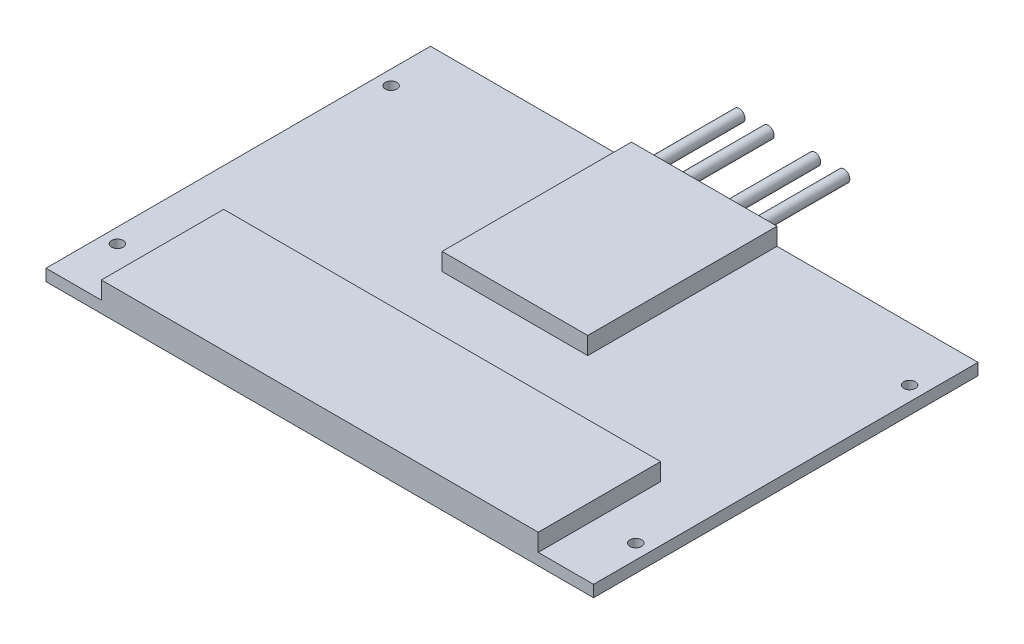
ISO-10303-21;
HEADER;
FILE_DESCRIPTION(('STEP AP214'),'2;1');
FILE_NAME('part.step','',(''),(''),'','','');
FILE_SCHEMA(('AUTOMOTIVE_DESIGN { 1 0 10303 214 1 1 1 1 }'));
ENDSEC;
DATA;
#1=APPLICATION_CONTEXT('core data for automotive mechanical design processes');
#2=APPLICATION_PROTOCOL_DEFINITION('international standard','automotive_design',2000,#1);
#3=PRODUCT_CONTEXT('',#1,'mechanical');
#4=PRODUCT('Part','Part','',(#3));
#5=PRODUCT_RELATED_PRODUCT_CATEGORY('part','',(#4));
#6=PRODUCT_DEFINITION_FORMATION('','',#4);
#7=PRODUCT_DEFINITION_CONTEXT('part definition',#1,'design');
#8=PRODUCT_DEFINITION('design','',#6,#7);
#9=PRODUCT_DEFINITION_SHAPE('','',#8);
#10=(LENGTH_UNIT() NAMED_UNIT(*) SI_UNIT(.MILLI.,.METRE.));
#11=(NAMED_UNIT(*) PLANE_ANGLE_UNIT() SI_UNIT($,.RADIAN.));
#12=(NAMED_UNIT(*) SI_UNIT($,.STERADIAN.) SOLID_ANGLE_UNIT());
#13=UNCERTAINTY_MEASURE_WITH_UNIT(LENGTH_MEASURE(1.E-05),#10,'distance_accuracy_value','');
#14=(GEOMETRIC_REPRESENTATION_CONTEXT(3) GLOBAL_UNCERTAINTY_ASSIGNED_CONTEXT((#13)) GLOBAL_UNIT_ASSIGNED_CONTEXT((#10,
#11,#12)) REPRESENTATION_CONTEXT('',''));
#15=CARTESIAN_POINT('',(0.,0.,0.));
#16=DIRECTION('',(0.,0.,1.));
#17=DIRECTION('',(1.,0.,0.));
#18=AXIS2_PLACEMENT_3D('',#15,#16,#17);
#19=CARTESIAN_POINT('',(0.,4.,0.));
#20=DIRECTION('',(0.,1.,0.));
#21=DIRECTION('',(0.,0.,1.));
#22=AXIS2_PLACEMENT_3D('',#19,#20,#21);
#23=PLANE('',#22);
#24=CARTESIAN_POINT('',(-89.0000000000001,4.,-113.5));
#25=DIRECTION('',(0.,1.,0.));
#26=DIRECTION('',(0.,0.,-1.));
#27=AXIS2_PLACEMENT_3D('',#24,#25,#26);
#28=CIRCLE('',#27,2.);
#29=CARTESIAN_POINT('',(-89.0000000000001,4.,-115.5));
#30=VERTEX_POINT('',#29);
#31=EDGE_CURVE('E506',#30,#30,#28,.T.);
#32=ORIENTED_EDGE('',*,*,#31,.F.);
#33=EDGE_LOOP('',(#32));
#34=FACE_BOUND('',#33,.T.);
#35=CARTESIAN_POINT('',(-89.0000000000001,4.,-19.5));
#36=DIRECTION('',(0.,1.,0.));
#37=DIRECTION('',(0.,0.,-1.));
#38=AXIS2_PLACEMENT_3D('',#35,#36,#37);
#39=CIRCLE('',#38,2.);
#40=CARTESIAN_POINT('',(-89.0000000000001,4.,-21.5));
#41=VERTEX_POINT('',#40);
#42=EDGE_CURVE('E507',#41,#41,#39,.T.);
#43=ORIENTED_EDGE('',*,*,#42,.F.);
#44=EDGE_LOOP('',(#43));
#45=FACE_BOUND('',#44,.T.);
#46=CARTESIAN_POINT('',(89.0000000000001,4.,-19.5));
#47=DIRECTION('',(0.,1.,0.));
#48=DIRECTION('',(0.,0.,1.));
#49=AXIS2_PLACEMENT_3D('',#46,#47,#48);
#50=CIRCLE('',#49,2.);
#51=CARTESIAN_POINT('',(89.0000000000001,4.,-17.5));
#52=VERTEX_POINT('',#51);
#53=EDGE_CURVE('E509',#52,#52,#50,.T.);
#54=ORIENTED_EDGE('',*,*,#53,.F.);
#55=EDGE_LOOP('',(#54));
#56=FACE_BOUND('',#55,.T.);
#57=CARTESIAN_POINT('',(89.0000000000001,4.,-113.5));
#58=DIRECTION('',(0.,1.,0.));
#59=DIRECTION('',(0.,0.,1.));
#60=AXIS2_PLACEMENT_3D('',#57,#58,#59);
#61=CIRCLE('',#60,2.);
#62=CARTESIAN_POINT('',(89.0000000000001,4.,-111.5));
#63=VERTEX_POINT('',#62);
#64=EDGE_CURVE('E231',#63,#63,#61,.T.);
#65=ORIENTED_EDGE('',*,*,#64,.F.);
#66=EDGE_LOOP('',(#65));
#67=FACE_BOUND('',#66,.T.);
#68=DIRECTION('',(1.,0.,0.));
#69=VECTOR('',#68,1.);
#70=CARTESIAN_POINT('',(-93.9999999999999,4.,0.));
#71=LINE('',#70,#69);
#72=CARTESIAN_POINT('',(-93.9999999999999,4.,0.));
#73=VERTEX_POINT('',#72);
#74=CARTESIAN_POINT('',(-75.,4.,0.));
#75=VERTEX_POINT('',#74);
#76=EDGE_CURVE('E152',#73,#75,#71,.T.);
#77=ORIENTED_EDGE('',*,*,#76,.T.);
#78=DIRECTION('',(0.,0.,1.));
#79=VECTOR('',#78,1.);
#80=CARTESIAN_POINT('',(-75.,4.,0.));
#81=LINE('',#80,#79);
#82=CARTESIAN_POINT('',(-75.,4.,-42.));
#83=VERTEX_POINT('',#82);
#84=EDGE_CURVE('E146',#83,#75,#81,.T.);
#85=ORIENTED_EDGE('',*,*,#84,.F.);
#86=DIRECTION('',(-1.,0.,0.));
#87=VECTOR('',#86,1.);
#88=CARTESIAN_POINT('',(-75.,4.,-42.));
#89=LINE('',#88,#87);
#90=CARTESIAN_POINT('',(75.,4.,-42.));
#91=VERTEX_POINT('',#90);
#92=EDGE_CURVE('E132',#91,#83,#89,.T.);
#93=ORIENTED_EDGE('',*,*,#92,.F.);
#94=DIRECTION('',(0.,0.,-1.));
#95=VECTOR('',#94,1.);
#96=CARTESIAN_POINT('',(75.,4.,0.));
#97=LINE('',#96,#95);
#98=CARTESIAN_POINT('',(75.,4.,0.));
#99=VERTEX_POINT('',#98);
#100=EDGE_CURVE('E139',#99,#91,#97,.T.);
#101=ORIENTED_EDGE('',*,*,#100,.F.);
#102=CARTESIAN_POINT('',(94.0000000000001,4.,0.));
#103=VERTEX_POINT('',#102);
#104=EDGE_CURVE('E192',#99,#103,#71,.T.);
#105=ORIENTED_EDGE('',*,*,#104,.T.);
#106=DIRECTION('',(0.,0.,-1.));
#107=VECTOR('',#106,1.);
#108=CARTESIAN_POINT('',(94.,4.,-132.));
#109=LINE('',#108,#107);
#110=CARTESIAN_POINT('',(94.,4.,-132.));
#111=VERTEX_POINT('',#110);
#112=EDGE_CURVE('E195',#103,#111,#109,.T.);
#113=ORIENTED_EDGE('',*,*,#112,.T.);
#114=DIRECTION('',(-1.,0.,0.));
#115=VECTOR('',#114,1.);
#116=CARTESIAN_POINT('',(-94.,4.,-132.));
#117=LINE('',#116,#115);
#118=CARTESIAN_POINT('',(25.,4.,-132.));
#119=VERTEX_POINT('',#118);
#120=EDGE_CURVE('E198',#111,#119,#117,.T.);
#121=ORIENTED_EDGE('',*,*,#120,.T.);
#122=DIRECTION('',(0.,0.,-1.));
#123=VECTOR('',#122,1.);
#124=CARTESIAN_POINT('',(25.,4.,-132.));
#125=LINE('',#124,#123);
#126=CARTESIAN_POINT('',(25.,4.,-67.));
#127=VERTEX_POINT('',#126);
#128=EDGE_CURVE('E169',#127,#119,#125,.T.);
#129=ORIENTED_EDGE('',*,*,#128,.F.);
#130=DIRECTION('',(1.,0.,0.));
#131=VECTOR('',#130,1.);
#132=CARTESIAN_POINT('',(-25.,4.,-67.));
#133=LINE('',#132,#131);
#134=CARTESIAN_POINT('',(-25.,4.,-67.));
#135=VERTEX_POINT('',#134);
#136=EDGE_CURVE('E66',#135,#127,#133,.T.);
#137=ORIENTED_EDGE('',*,*,#136,.F.);
#138=DIRECTION('',(0.,0.,1.));
#139=VECTOR('',#138,1.);
#140=CARTESIAN_POINT('',(-25.,4.,-132.));
#141=LINE('',#140,#139);
#142=CARTESIAN_POINT('',(-25.,4.,-132.));
#143=VERTEX_POINT('',#142);
#144=EDGE_CURVE('E153',#143,#135,#141,.T.);
#145=ORIENTED_EDGE('',*,*,#144,.F.);
#146=CARTESIAN_POINT('',(-94.,4.,-132.));
#147=VERTEX_POINT('',#146);
#148=EDGE_CURVE('E197',#143,#147,#117,.T.);
#149=ORIENTED_EDGE('',*,*,#148,.T.);
#150=DIRECTION('',(0.,0.,1.));
#151=VECTOR('',#150,1.);
#152=CARTESIAN_POINT('',(-94.,4.,-132.));
#153=LINE('',#152,#151);
#154=EDGE_CURVE('E190',#147,#73,#153,.T.);
#155=ORIENTED_EDGE('',*,*,#154,.T.);
#156=EDGE_LOOP('',(#77,#85,#93,#101,#105,#113,#121,#129,#137,#145,#149,#155));
#157=FACE_BOUND('',#156,.T.);
#158=ADVANCED_FACE('F41',(#34,#45,#56,#67,#157),#23,.T.);
#159=CARTESIAN_POINT('',(-94.,4.,-132.));
#160=DIRECTION('',(1.,0.,0.));
#161=DIRECTION('',(0.,0.,-1.));
#162=AXIS2_PLACEMENT_3D('',#159,#160,#161);
#163=PLANE('',#162);
#164=DIRECTION('',(0.,0.,1.));
#165=VECTOR('',#164,1.);
#166=CARTESIAN_POINT('',(-94.,0.,-132.));
#167=LINE('',#166,#165);
#168=CARTESIAN_POINT('',(-94.,0.,-132.));
#169=VERTEX_POINT('',#168);
#170=CARTESIAN_POINT('',(-93.9999999999999,0.,0.));
#171=VERTEX_POINT('',#170);
#172=EDGE_CURVE('E189',#169,#171,#167,.T.);
#173=ORIENTED_EDGE('',*,*,#172,.T.);
#174=DIRECTION('',(0.,-1.,0.));
#175=VECTOR('',#174,1.);
#176=CARTESIAN_POINT('',(-93.9999999999999,4.,0.));
#177=LINE('',#176,#175);
#178=EDGE_CURVE('E216',#73,#171,#177,.T.);
#179=ORIENTED_EDGE('',*,*,#178,.F.);
#180=ORIENTED_EDGE('',*,*,#154,.F.);
#181=DIRECTION('',(0.,-1.,0.));
#182=VECTOR('',#181,1.);
#183=CARTESIAN_POINT('',(-94.,4.,-132.));
#184=LINE('',#183,#182);
#185=EDGE_CURVE('E200',#147,#169,#184,.T.);
#186=ORIENTED_EDGE('',*,*,#185,.T.);
#187=EDGE_LOOP('',(#173,#179,#180,#186));
#188=FACE_BOUND('',#187,.T.);
#189=ADVANCED_FACE('F43',(#188),#163,.F.);
#190=CARTESIAN_POINT('',(-93.9999999999999,4.,0.));
#191=DIRECTION('',(0.,0.,-1.));
#192=DIRECTION('',(-1.,0.,0.));
#193=AXIS2_PLACEMENT_3D('',#190,#191,#192);
#194=PLANE('',#193);
#195=DIRECTION('',(1.,0.,0.));
#196=VECTOR('',#195,1.);
#197=CARTESIAN_POINT('',(-93.9999999999999,0.,0.));
#198=LINE('',#197,#196);
#199=CARTESIAN_POINT('',(94.0000000000001,0.,0.));
#200=VERTEX_POINT('',#199);
#201=EDGE_CURVE('E203',#171,#200,#198,.T.);
#202=ORIENTED_EDGE('',*,*,#201,.T.);
#203=DIRECTION('',(0.,-1.,0.));
#204=VECTOR('',#203,1.);
#205=CARTESIAN_POINT('',(94.0000000000001,4.,0.));
#206=LINE('',#205,#204);
#207=EDGE_CURVE('E213',#103,#200,#206,.T.);
#208=ORIENTED_EDGE('',*,*,#207,.F.);
#209=ORIENTED_EDGE('',*,*,#104,.F.);
#210=DIRECTION('',(0.,-1.,0.));
#211=VECTOR('',#210,1.);
#212=CARTESIAN_POINT('',(75.,10.,0.));
#213=LINE('',#212,#211);
#214=CARTESIAN_POINT('',(75.,10.,0.));
#215=VERTEX_POINT('',#214);
#216=EDGE_CURVE('E259',#215,#99,#213,.T.);
#217=ORIENTED_EDGE('',*,*,#216,.F.);
#218=DIRECTION('',(1.,0.,0.));
#219=VECTOR('',#218,1.);
#220=CARTESIAN_POINT('',(-75.,10.,0.));
#221=LINE('',#220,#219);
#222=CARTESIAN_POINT('',(-75.,10.,0.));
#223=VERTEX_POINT('',#222);
#224=EDGE_CURVE('E162',#223,#215,#221,.T.);
#225=ORIENTED_EDGE('',*,*,#224,.F.);
#226=DIRECTION('',(0.,-1.,0.));
#227=VECTOR('',#226,1.);
#228=CARTESIAN_POINT('',(-75.,10.,0.));
#229=LINE('',#228,#227);
#230=EDGE_CURVE('E257',#223,#75,#229,.T.);
#231=ORIENTED_EDGE('',*,*,#230,.T.);
#232=ORIENTED_EDGE('',*,*,#76,.F.);
#233=ORIENTED_EDGE('',*,*,#178,.T.);
#234=EDGE_LOOP('',(#202,#208,#209,#217,#225,#231,#232,#233));
#235=FACE_BOUND('',#234,.T.);
#236=ADVANCED_FACE('F268',(#235),#194,.F.);
#237=CARTESIAN_POINT('',(94.,4.,-132.));
#238=DIRECTION('',(-1.,0.,0.));
#239=DIRECTION('',(0.,0.,1.));
#240=AXIS2_PLACEMENT_3D('',#237,#238,#239);
#241=PLANE('',#240);
#242=DIRECTION('',(0.,0.,-1.));
#243=VECTOR('',#242,1.);
#244=CARTESIAN_POINT('',(94.,0.,-132.));
#245=LINE('',#244,#243);
#246=CARTESIAN_POINT('',(94.,0.,-132.));
#247=VERTEX_POINT('',#246);
#248=EDGE_CURVE('E205',#200,#247,#245,.T.);
#249=ORIENTED_EDGE('',*,*,#248,.T.);
#250=DIRECTION('',(0.,-1.,0.));
#251=VECTOR('',#250,1.);
#252=CARTESIAN_POINT('',(94.,4.,-132.));
#253=LINE('',#252,#251);
#254=EDGE_CURVE('E210',#111,#247,#253,.T.);
#255=ORIENTED_EDGE('',*,*,#254,.F.);
#256=ORIENTED_EDGE('',*,*,#112,.F.);
#257=ORIENTED_EDGE('',*,*,#207,.T.);
#258=EDGE_LOOP('',(#249,#255,#256,#257));
#259=FACE_BOUND('',#258,.T.);
#260=ADVANCED_FACE('F273',(#259),#241,.F.);
#261=CARTESIAN_POINT('',(-94.,4.,-132.));
#262=DIRECTION('',(0.,0.,1.));
#263=DIRECTION('',(1.,0.,0.));
#264=AXIS2_PLACEMENT_3D('',#261,#262,#263);
#265=PLANE('',#264);
#266=CARTESIAN_POINT('',(-18.,6.50000000000001,-132.));
#267=DIRECTION('',(0.,0.,1.));
#268=DIRECTION('',(1.,0.,0.));
#269=AXIS2_PLACEMENT_3D('',#266,#267,#268);
#270=CIRCLE('',#269,2.);
#271=CARTESIAN_POINT('',(-16.,6.50000000000001,-132.));
#272=VERTEX_POINT('',#271);
#273=EDGE_CURVE('E11',#272,#272,#270,.F.);
#274=ORIENTED_EDGE('',*,*,#273,.F.);
#275=EDGE_LOOP('',(#274));
#276=FACE_BOUND('',#275,.T.);
#277=CARTESIAN_POINT('',(-8.00000000000003,6.50000000000001,-132.));
#278=DIRECTION('',(0.,0.,1.));
#279=DIRECTION('',(1.,0.,0.));
#280=AXIS2_PLACEMENT_3D('',#277,#278,#279);
#281=CIRCLE('',#280,2.);
#282=CARTESIAN_POINT('',(-6.00000000000003,6.50000000000001,-132.));
#283=VERTEX_POINT('',#282);
#284=EDGE_CURVE('E50',#283,#283,#281,.F.);
#285=ORIENTED_EDGE('',*,*,#284,.F.);
#286=EDGE_LOOP('',(#285));
#287=FACE_BOUND('',#286,.T.);
#288=CARTESIAN_POINT('',(7.99999999999999,6.50000000000001,-132.));
#289=DIRECTION('',(0.,0.,1.));
#290=DIRECTION('',(1.,0.,0.));
#291=AXIS2_PLACEMENT_3D('',#288,#289,#290);
#292=CIRCLE('',#291,2.);
#293=CARTESIAN_POINT('',(9.99999999999999,6.50000000000001,-132.));
#294=VERTEX_POINT('',#293);
#295=EDGE_CURVE('E222',#294,#294,#292,.F.);
#296=ORIENTED_EDGE('',*,*,#295,.F.);
#297=EDGE_LOOP('',(#296));
#298=FACE_BOUND('',#297,.T.);
#299=CARTESIAN_POINT('',(18.,6.50000000000001,-132.));
#300=DIRECTION('',(0.,0.,1.));
#301=DIRECTION('',(1.,0.,0.));
#302=AXIS2_PLACEMENT_3D('',#299,#300,#301);
#303=CIRCLE('',#302,2.);
#304=CARTESIAN_POINT('',(20.,6.50000000000001,-132.));
#305=VERTEX_POINT('',#304);
#306=EDGE_CURVE('E219',#305,#305,#303,.F.);
#307=ORIENTED_EDGE('',*,*,#306,.F.);
#308=EDGE_LOOP('',(#307));
#309=FACE_BOUND('',#308,.T.);
#310=DIRECTION('',(-1.,0.,0.));
#311=VECTOR('',#310,1.);
#312=CARTESIAN_POINT('',(-94.,0.,-132.));
#313=LINE('',#312,#311);
#314=EDGE_CURVE('E193',#247,#169,#313,.T.);
#315=ORIENTED_EDGE('',*,*,#314,.T.);
#316=ORIENTED_EDGE('',*,*,#185,.F.);
#317=ORIENTED_EDGE('',*,*,#148,.F.);
#318=DIRECTION('',(0.,-1.,0.));
#319=VECTOR('',#318,1.);
#320=CARTESIAN_POINT('',(-25.,10.,-132.));
#321=LINE('',#320,#319);
#322=CARTESIAN_POINT('',(-25.,10.,-132.));
#323=VERTEX_POINT('',#322);
#324=EDGE_CURVE('E174',#323,#143,#321,.T.);
#325=ORIENTED_EDGE('',*,*,#324,.F.);
#326=DIRECTION('',(-1.,0.,0.));
#327=VECTOR('',#326,1.);
#328=CARTESIAN_POINT('',(-25.,10.,-132.));
#329=LINE('',#328,#327);
#330=CARTESIAN_POINT('',(25.,10.,-132.));
#331=VERTEX_POINT('',#330);
#332=EDGE_CURVE('E173',#331,#323,#329,.T.);
#333=ORIENTED_EDGE('',*,*,#332,.F.);
#334=DIRECTION('',(0.,-1.,0.));
#335=VECTOR('',#334,1.);
#336=CARTESIAN_POINT('',(25.,10.,-132.));
#337=LINE('',#336,#335);
#338=EDGE_CURVE('E181',#331,#119,#337,.T.);
#339=ORIENTED_EDGE('',*,*,#338,.T.);
#340=ORIENTED_EDGE('',*,*,#120,.F.);
#341=ORIENTED_EDGE('',*,*,#254,.T.);
#342=EDGE_LOOP('',(#315,#316,#317,#325,#333,#339,#340,#341));
#343=FACE_BOUND('',#342,.T.);
#344=ADVANCED_FACE('F282',(#276,#287,#298,#309,#343),#265,.F.);
#345=CARTESIAN_POINT('',(0.,0.,0.));
#346=DIRECTION('',(0.,1.,0.));
#347=DIRECTION('',(0.,0.,1.));
#348=AXIS2_PLACEMENT_3D('',#345,#346,#347);
#349=PLANE('',#348);
#350=CARTESIAN_POINT('',(-89.0000000000001,0.,-113.5));
#351=DIRECTION('',(0.,1.,0.));
#352=DIRECTION('',(0.,0.,1.));
#353=AXIS2_PLACEMENT_3D('',#350,#351,#352);
#354=CIRCLE('',#353,2.);
#355=CARTESIAN_POINT('',(-89.0000000000001,0.,-111.5));
#356=VERTEX_POINT('',#355);
#357=EDGE_CURVE('E45',#356,#356,#354,.T.);
#358=ORIENTED_EDGE('',*,*,#357,.T.);
#359=EDGE_LOOP('',(#358));
#360=FACE_BOUND('',#359,.T.);
#361=CARTESIAN_POINT('',(-89.0000000000001,0.,-19.5));
#362=DIRECTION('',(0.,1.,0.));
#363=DIRECTION('',(0.,0.,1.));
#364=AXIS2_PLACEMENT_3D('',#361,#362,#363);
#365=CIRCLE('',#364,2.);
#366=CARTESIAN_POINT('',(-89.0000000000001,0.,-17.5));
#367=VERTEX_POINT('',#366);
#368=EDGE_CURVE('E233',#367,#367,#365,.T.);
#369=ORIENTED_EDGE('',*,*,#368,.T.);
#370=EDGE_LOOP('',(#369));
#371=FACE_BOUND('',#370,.T.);
#372=CARTESIAN_POINT('',(89.0000000000001,0.,-19.5));
#373=DIRECTION('',(0.,1.,0.));
#374=DIRECTION('',(0.,0.,1.));
#375=AXIS2_PLACEMENT_3D('',#372,#373,#374);
#376=CIRCLE('',#375,2.);
#377=CARTESIAN_POINT('',(89.0000000000001,0.,-17.5));
#378=VERTEX_POINT('',#377);
#379=EDGE_CURVE('E230',#378,#378,#376,.T.);
#380=ORIENTED_EDGE('',*,*,#379,.T.);
#381=EDGE_LOOP('',(#380));
#382=FACE_BOUND('',#381,.T.);
#383=CARTESIAN_POINT('',(89.0000000000001,0.,-113.5));
#384=DIRECTION('',(0.,1.,0.));
#385=DIRECTION('',(0.,0.,1.));
#386=AXIS2_PLACEMENT_3D('',#383,#384,#385);
#387=CIRCLE('',#386,2.);
#388=CARTESIAN_POINT('',(89.0000000000001,0.,-111.5));
#389=VERTEX_POINT('',#388);
#390=EDGE_CURVE('E227',#389,#389,#387,.T.);
#391=ORIENTED_EDGE('',*,*,#390,.T.);
#392=EDGE_LOOP('',(#391));
#393=FACE_BOUND('',#392,.T.);
#394=ORIENTED_EDGE('',*,*,#172,.F.);
#395=ORIENTED_EDGE('',*,*,#314,.F.);
#396=ORIENTED_EDGE('',*,*,#248,.F.);
#397=ORIENTED_EDGE('',*,*,#201,.F.);
#398=EDGE_LOOP('',(#394,#395,#396,#397));
#399=FACE_BOUND('',#398,.T.);
#400=ADVANCED_FACE('F327',(#360,#371,#382,#393,#399),#349,.F.);
#401=CARTESIAN_POINT('',(-25.,10.,-132.));
#402=DIRECTION('',(1.,0.,0.));
#403=DIRECTION('',(0.,0.,-1.));
#404=AXIS2_PLACEMENT_3D('',#401,#402,#403);
#405=PLANE('',#404);
#406=ORIENTED_EDGE('',*,*,#144,.T.);
#407=DIRECTION('',(0.,-1.,0.));
#408=VECTOR('',#407,1.);
#409=CARTESIAN_POINT('',(-25.,10.,-67.));
#410=LINE('',#409,#408);
#411=CARTESIAN_POINT('',(-25.,10.,-67.));
#412=VERTEX_POINT('',#411);
#413=EDGE_CURVE('E187',#412,#135,#410,.T.);
#414=ORIENTED_EDGE('',*,*,#413,.F.);
#415=DIRECTION('',(0.,0.,1.));
#416=VECTOR('',#415,1.);
#417=CARTESIAN_POINT('',(-25.,10.,-132.));
#418=LINE('',#417,#416);
#419=EDGE_CURVE('E165',#323,#412,#418,.T.);
#420=ORIENTED_EDGE('',*,*,#419,.F.);
#421=ORIENTED_EDGE('',*,*,#324,.T.);
#422=EDGE_LOOP('',(#406,#414,#420,#421));
#423=FACE_BOUND('',#422,.T.);
#424=ADVANCED_FACE('F292',(#423),#405,.F.);
#425=CARTESIAN_POINT('',(-25.,10.,-67.));
#426=DIRECTION('',(0.,0.,-1.));
#427=DIRECTION('',(-1.,0.,0.));
#428=AXIS2_PLACEMENT_3D('',#425,#426,#427);
#429=PLANE('',#428);
#430=ORIENTED_EDGE('',*,*,#136,.T.);
#431=DIRECTION('',(0.,-1.,0.));
#432=VECTOR('',#431,1.);
#433=CARTESIAN_POINT('',(25.,10.,-67.));
#434=LINE('',#433,#432);
#435=CARTESIAN_POINT('',(25.,10.,-67.));
#436=VERTEX_POINT('',#435);
#437=EDGE_CURVE('E184',#436,#127,#434,.T.);
#438=ORIENTED_EDGE('',*,*,#437,.F.);
#439=DIRECTION('',(1.,0.,0.));
#440=VECTOR('',#439,1.);
#441=CARTESIAN_POINT('',(-25.,10.,-67.));
#442=LINE('',#441,#440);
#443=EDGE_CURVE('E168',#412,#436,#442,.T.);
#444=ORIENTED_EDGE('',*,*,#443,.F.);
#445=ORIENTED_EDGE('',*,*,#413,.T.);
#446=EDGE_LOOP('',(#430,#438,#444,#445));
#447=FACE_BOUND('',#446,.T.);
#448=ADVANCED_FACE('F290',(#447),#429,.F.);
#449=CARTESIAN_POINT('',(25.,10.,-132.));
#450=DIRECTION('',(-1.,0.,0.));
#451=DIRECTION('',(0.,0.,1.));
#452=AXIS2_PLACEMENT_3D('',#449,#450,#451);
#453=PLANE('',#452);
#454=ORIENTED_EDGE('',*,*,#128,.T.);
#455=ORIENTED_EDGE('',*,*,#338,.F.);
#456=DIRECTION('',(0.,0.,-1.));
#457=VECTOR('',#456,1.);
#458=CARTESIAN_POINT('',(25.,10.,-132.));
#459=LINE('',#458,#457);
#460=EDGE_CURVE('E171',#436,#331,#459,.T.);
#461=ORIENTED_EDGE('',*,*,#460,.F.);
#462=ORIENTED_EDGE('',*,*,#437,.T.);
#463=EDGE_LOOP('',(#454,#455,#461,#462));
#464=FACE_BOUND('',#463,.T.);
#465=ADVANCED_FACE('F278',(#464),#453,.F.);
#466=CARTESIAN_POINT('',(0.,10.,0.));
#467=DIRECTION('',(0.,1.,0.));
#468=DIRECTION('',(0.,0.,1.));
#469=AXIS2_PLACEMENT_3D('',#466,#467,#468);
#470=PLANE('',#469);
#471=ORIENTED_EDGE('',*,*,#419,.T.);
#472=ORIENTED_EDGE('',*,*,#443,.T.);
#473=ORIENTED_EDGE('',*,*,#460,.T.);
#474=ORIENTED_EDGE('',*,*,#332,.T.);
#475=EDGE_LOOP('',(#471,#472,#473,#474));
#476=FACE_BOUND('',#475,.T.);
#477=ADVANCED_FACE('F287',(#476),#470,.T.);
#478=CARTESIAN_POINT('',(-75.,10.,0.));
#479=DIRECTION('',(1.,0.,0.));
#480=DIRECTION('',(0.,0.,-1.));
#481=AXIS2_PLACEMENT_3D('',#478,#479,#480);
#482=PLANE('',#481);
#483=ORIENTED_EDGE('',*,*,#84,.T.);
#484=ORIENTED_EDGE('',*,*,#230,.F.);
#485=DIRECTION('',(0.,0.,1.));
#486=VECTOR('',#485,1.);
#487=CARTESIAN_POINT('',(-75.,10.,0.));
#488=LINE('',#487,#486);
#489=CARTESIAN_POINT('',(-75.,10.,-42.));
#490=VERTEX_POINT('',#489);
#491=EDGE_CURVE('E140',#490,#223,#488,.T.);
#492=ORIENTED_EDGE('',*,*,#491,.F.);
#493=DIRECTION('',(0.,-1.,0.));
#494=VECTOR('',#493,1.);
#495=CARTESIAN_POINT('',(-75.,10.,-42.));
#496=LINE('',#495,#494);
#497=EDGE_CURVE('E135',#490,#83,#496,.T.);
#498=ORIENTED_EDGE('',*,*,#497,.T.);
#499=EDGE_LOOP('',(#483,#484,#492,#498));
#500=FACE_BOUND('',#499,.T.);
#501=ADVANCED_FACE('F144',(#500),#482,.F.);
#502=CARTESIAN_POINT('',(75.,10.,0.));
#503=DIRECTION('',(-1.,0.,0.));
#504=DIRECTION('',(0.,0.,1.));
#505=AXIS2_PLACEMENT_3D('',#502,#503,#504);
#506=PLANE('',#505);
#507=ORIENTED_EDGE('',*,*,#100,.T.);
#508=DIRECTION('',(0.,-1.,0.));
#509=VECTOR('',#508,1.);
#510=CARTESIAN_POINT('',(75.,10.,-42.));
#511=LINE('',#510,#509);
#512=CARTESIAN_POINT('',(75.,10.,-42.));
#513=VERTEX_POINT('',#512);
#514=EDGE_CURVE('E58',#513,#91,#511,.T.);
#515=ORIENTED_EDGE('',*,*,#514,.F.);
#516=DIRECTION('',(0.,0.,-1.));
#517=VECTOR('',#516,1.);
#518=CARTESIAN_POINT('',(75.,10.,0.));
#519=LINE('',#518,#517);
#520=EDGE_CURVE('E160',#215,#513,#519,.T.);
#521=ORIENTED_EDGE('',*,*,#520,.F.);
#522=ORIENTED_EDGE('',*,*,#216,.T.);
#523=EDGE_LOOP('',(#507,#515,#521,#522));
#524=FACE_BOUND('',#523,.T.);
#525=ADVANCED_FACE('F264',(#524),#506,.F.);
#526=CARTESIAN_POINT('',(-75.,10.,-42.));
#527=DIRECTION('',(0.,0.,1.));
#528=DIRECTION('',(1.,0.,0.));
#529=AXIS2_PLACEMENT_3D('',#526,#527,#528);
#530=PLANE('',#529);
#531=ORIENTED_EDGE('',*,*,#92,.T.);
#532=ORIENTED_EDGE('',*,*,#497,.F.);
#533=DIRECTION('',(-1.,0.,0.));
#534=VECTOR('',#533,1.);
#535=CARTESIAN_POINT('',(-75.,10.,-42.));
#536=LINE('',#535,#534);
#537=EDGE_CURVE('E149',#513,#490,#536,.T.);
#538=ORIENTED_EDGE('',*,*,#537,.F.);
#539=ORIENTED_EDGE('',*,*,#514,.T.);
#540=EDGE_LOOP('',(#531,#532,#538,#539));
#541=FACE_BOUND('',#540,.T.);
#542=ADVANCED_FACE('F134',(#541),#530,.F.);
#543=CARTESIAN_POINT('',(0.,10.,0.));
#544=DIRECTION('',(0.,-1.,0.));
#545=DIRECTION('',(0.,0.,-1.));
#546=AXIS2_PLACEMENT_3D('',#543,#544,#545);
#547=PLANE('',#546);
#548=ORIENTED_EDGE('',*,*,#491,.T.);
#549=ORIENTED_EDGE('',*,*,#224,.T.);
#550=ORIENTED_EDGE('',*,*,#520,.T.);
#551=ORIENTED_EDGE('',*,*,#537,.T.);
#552=EDGE_LOOP('',(#548,#549,#550,#551));
#553=FACE_BOUND('',#552,.T.);
#554=ADVANCED_FACE('F300',(#553),#547,.F.);
#555=CARTESIAN_POINT('',(18.,6.50000000000001,-162.));
#556=DIRECTION('',(0.,0.,1.));
#557=DIRECTION('',(1.,0.,0.));
#558=AXIS2_PLACEMENT_3D('',#555,#556,#557);
#559=CYLINDRICAL_SURFACE('',#558,2.);
#560=CARTESIAN_POINT('',(18.,6.50000000000001,-162.));
#561=DIRECTION('',(0.,0.,-1.));
#562=DIRECTION('',(-1.,0.,0.));
#563=AXIS2_PLACEMENT_3D('',#560,#561,#562);
#564=CIRCLE('',#563,2.);
#565=CARTESIAN_POINT('',(16.,6.50000000000001,-162.));
#566=VERTEX_POINT('',#565);
#567=EDGE_CURVE('E254',#566,#566,#564,.T.);
#568=ORIENTED_EDGE('',*,*,#567,.F.);
#569=EDGE_LOOP('',(#568));
#570=FACE_BOUND('',#569,.T.);
#571=ORIENTED_EDGE('',*,*,#306,.T.);
#572=EDGE_LOOP('',(#571));
#573=FACE_BOUND('',#572,.T.);
#574=ADVANCED_FACE('F302',(#570,#573),#559,.T.);
#575=CARTESIAN_POINT('',(18.,6.50000000000001,-162.));
#576=DIRECTION('',(0.,0.,-1.));
#577=DIRECTION('',(-1.,0.,0.));
#578=AXIS2_PLACEMENT_3D('',#575,#576,#577);
#579=PLANE('',#578);
#580=ORIENTED_EDGE('',*,*,#567,.T.);
#581=EDGE_LOOP('',(#580));
#582=FACE_BOUND('',#581,.T.);
#583=ADVANCED_FACE('F309',(#582),#579,.T.);
#584=CARTESIAN_POINT('',(7.99999999999998,6.50000000000001,-162.));
#585=DIRECTION('',(0.,0.,1.));
#586=DIRECTION('',(1.,0.,0.));
#587=AXIS2_PLACEMENT_3D('',#584,#585,#586);
#588=CYLINDRICAL_SURFACE('',#587,2.);
#589=CARTESIAN_POINT('',(7.99999999999998,6.50000000000001,-162.));
#590=DIRECTION('',(0.,0.,-1.));
#591=DIRECTION('',(-1.,0.,0.));
#592=AXIS2_PLACEMENT_3D('',#589,#590,#591);
#593=CIRCLE('',#592,2.);
#594=CARTESIAN_POINT('',(5.99999999999998,6.50000000000001,-162.));
#595=VERTEX_POINT('',#594);
#596=EDGE_CURVE('E247',#595,#595,#593,.T.);
#597=ORIENTED_EDGE('',*,*,#596,.F.);
#598=EDGE_LOOP('',(#597));
#599=FACE_BOUND('',#598,.T.);
#600=ORIENTED_EDGE('',*,*,#295,.T.);
#601=EDGE_LOOP('',(#600));
#602=FACE_BOUND('',#601,.T.);
#603=ADVANCED_FACE('F403',(#599,#602),#588,.T.);
#604=CARTESIAN_POINT('',(7.99999999999998,6.50000000000001,-162.));
#605=DIRECTION('',(0.,0.,-1.));
#606=DIRECTION('',(-1.,0.,0.));
#607=AXIS2_PLACEMENT_3D('',#604,#605,#606);
#608=PLANE('',#607);
#609=ORIENTED_EDGE('',*,*,#596,.T.);
#610=EDGE_LOOP('',(#609));
#611=FACE_BOUND('',#610,.T.);
#612=ADVANCED_FACE('F413',(#611),#608,.T.);
#613=CARTESIAN_POINT('',(-8.00000000000003,6.50000000000001,-162.));
#614=DIRECTION('',(0.,0.,1.));
#615=DIRECTION('',(1.,0.,0.));
#616=AXIS2_PLACEMENT_3D('',#613,#614,#615);
#617=CYLINDRICAL_SURFACE('',#616,2.);
#618=CARTESIAN_POINT('',(-8.00000000000003,6.50000000000001,-162.));
#619=DIRECTION('',(0.,0.,-1.));
#620=DIRECTION('',(1.,0.,0.));
#621=AXIS2_PLACEMENT_3D('',#618,#619,#620);
#622=CIRCLE('',#621,2.);
#623=CARTESIAN_POINT('',(-6.00000000000003,6.50000000000001,-162.));
#624=VERTEX_POINT('',#623);
#625=EDGE_CURVE('E242',#624,#624,#622,.T.);
#626=ORIENTED_EDGE('',*,*,#625,.F.);
#627=EDGE_LOOP('',(#626));
#628=FACE_BOUND('',#627,.T.);
#629=ORIENTED_EDGE('',*,*,#284,.T.);
#630=EDGE_LOOP('',(#629));
#631=FACE_BOUND('',#630,.T.);
#632=ADVANCED_FACE('F423',(#628,#631),#617,.T.);
#633=CARTESIAN_POINT('',(-8.00000000000003,6.50000000000001,-162.));
#634=DIRECTION('',(0.,0.,1.));
#635=DIRECTION('',(1.,0.,0.));
#636=AXIS2_PLACEMENT_3D('',#633,#634,#635);
#637=PLANE('',#636);
#638=ORIENTED_EDGE('',*,*,#625,.T.);
#639=EDGE_LOOP('',(#638));
#640=FACE_BOUND('',#639,.T.);
#641=ADVANCED_FACE('F433',(#640),#637,.F.);
#642=CARTESIAN_POINT('',(-18.,6.50000000000001,-162.));
#643=DIRECTION('',(0.,0.,1.));
#644=DIRECTION('',(1.,0.,0.));
#645=AXIS2_PLACEMENT_3D('',#642,#643,#644);
#646=CYLINDRICAL_SURFACE('',#645,2.);
#647=CARTESIAN_POINT('',(-18.,6.50000000000001,-162.));
#648=DIRECTION('',(0.,0.,-1.));
#649=DIRECTION('',(1.,0.,0.));
#650=AXIS2_PLACEMENT_3D('',#647,#648,#649);
#651=CIRCLE('',#650,2.);
#652=CARTESIAN_POINT('',(-16.,6.50000000000001,-162.));
#653=VERTEX_POINT('',#652);
#654=EDGE_CURVE('E238',#653,#653,#651,.T.);
#655=ORIENTED_EDGE('',*,*,#654,.F.);
#656=EDGE_LOOP('',(#655));
#657=FACE_BOUND('',#656,.T.);
#658=ORIENTED_EDGE('',*,*,#273,.T.);
#659=EDGE_LOOP('',(#658));
#660=FACE_BOUND('',#659,.T.);
#661=ADVANCED_FACE('F443',(#657,#660),#646,.T.);
#662=CARTESIAN_POINT('',(-18.,6.50000000000001,-162.));
#663=DIRECTION('',(0.,0.,1.));
#664=DIRECTION('',(1.,0.,0.));
#665=AXIS2_PLACEMENT_3D('',#662,#663,#664);
#666=PLANE('',#665);
#667=ORIENTED_EDGE('',*,*,#654,.T.);
#668=EDGE_LOOP('',(#667));
#669=FACE_BOUND('',#668,.T.);
#670=ADVANCED_FACE('F453',(#669),#666,.F.);
#671=CARTESIAN_POINT('',(89.0000000000001,-6.,-113.5));
#672=DIRECTION('',(0.,1.,0.));
#673=DIRECTION('',(0.,0.,1.));
#674=AXIS2_PLACEMENT_3D('',#671,#672,#673);
#675=CYLINDRICAL_SURFACE('',#674,2.);
#676=ORIENTED_EDGE('',*,*,#64,.T.);
#677=EDGE_LOOP('',(#676));
#678=FACE_BOUND('',#677,.T.);
#679=ORIENTED_EDGE('',*,*,#390,.F.);
#680=EDGE_LOOP('',(#679));
#681=FACE_BOUND('',#680,.T.);
#682=ADVANCED_FACE('F462',(#678,#681),#675,.F.);
#683=CARTESIAN_POINT('',(89.0000000000001,-6.,-19.5));
#684=DIRECTION('',(0.,1.,0.));
#685=DIRECTION('',(0.,0.,1.));
#686=AXIS2_PLACEMENT_3D('',#683,#684,#685);
#687=CYLINDRICAL_SURFACE('',#686,2.);
#688=ORIENTED_EDGE('',*,*,#53,.T.);
#689=EDGE_LOOP('',(#688));
#690=FACE_BOUND('',#689,.T.);
#691=ORIENTED_EDGE('',*,*,#379,.F.);
#692=EDGE_LOOP('',(#691));
#693=FACE_BOUND('',#692,.T.);
#694=ADVANCED_FACE('F471',(#690,#693),#687,.F.);
#695=CARTESIAN_POINT('',(-89.0000000000001,-6.,-19.5));
#696=DIRECTION('',(0.,1.,0.));
#697=DIRECTION('',(0.,0.,1.));
#698=AXIS2_PLACEMENT_3D('',#695,#696,#697);
#699=CYLINDRICAL_SURFACE('',#698,2.);
#700=ORIENTED_EDGE('',*,*,#42,.T.);
#701=EDGE_LOOP('',(#700));
#702=FACE_BOUND('',#701,.T.);
#703=ORIENTED_EDGE('',*,*,#368,.F.);
#704=EDGE_LOOP('',(#703));
#705=FACE_BOUND('',#704,.T.);
#706=ADVANCED_FACE('F481',(#702,#705),#699,.F.);
#707=CARTESIAN_POINT('',(-89.0000000000001,-6.,-113.5));
#708=DIRECTION('',(0.,1.,0.));
#709=DIRECTION('',(0.,0.,1.));
#710=AXIS2_PLACEMENT_3D('',#707,#708,#709);
#711=CYLINDRICAL_SURFACE('',#710,2.);
#712=ORIENTED_EDGE('',*,*,#31,.T.);
#713=EDGE_LOOP('',(#712));
#714=FACE_BOUND('',#713,.T.);
#715=ORIENTED_EDGE('',*,*,#357,.F.);
#716=EDGE_LOOP('',(#715));
#717=FACE_BOUND('',#716,.T.);
#718=ADVANCED_FACE('F491',(#714,#717),#711,.F.);
#719=CLOSED_SHELL('',(#158,#189,#236,#260,#344,#400,#424,#448,#465,#477,#501,#525,#542,#554,
#574,#583,#603,#612,#632,#641,#661,#670,#682,#694,#706,#718));
#720=MANIFOLD_SOLID_BREP('B2',#719);
#721=ADVANCED_BREP_SHAPE_REPRESENTATION('',(#18,#720),#14);
#722=SHAPE_DEFINITION_REPRESENTATION(#9,#721);
ENDSEC;
END-ISO-10303-21;
